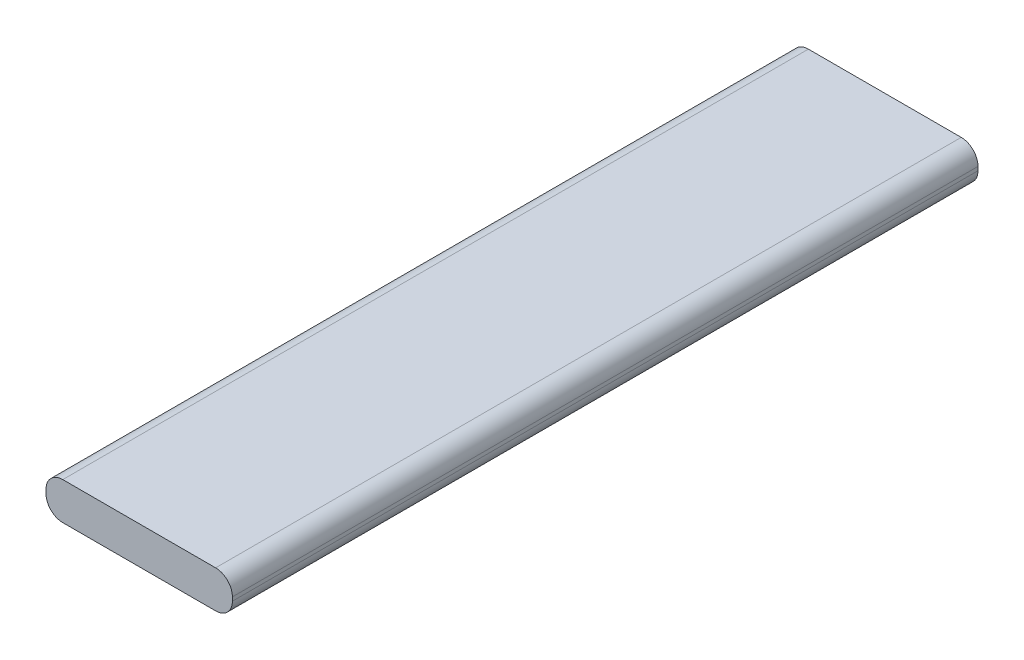
ISO-10303-21;
HEADER;
FILE_DESCRIPTION(('STEP AP214'),'2;1');
FILE_NAME('part.step','',(''),(''),'','','');
FILE_SCHEMA(('AUTOMOTIVE_DESIGN { 1 0 10303 214 1 1 1 1 }'));
ENDSEC;
DATA;
#1=APPLICATION_CONTEXT('core data for automotive mechanical design processes');
#2=APPLICATION_PROTOCOL_DEFINITION('international standard','automotive_design',2000,#1);
#3=PRODUCT_CONTEXT('',#1,'mechanical');
#4=PRODUCT('Part','Part','',(#3));
#5=PRODUCT_RELATED_PRODUCT_CATEGORY('part','',(#4));
#6=PRODUCT_DEFINITION_FORMATION('','',#4);
#7=PRODUCT_DEFINITION_CONTEXT('part definition',#1,'design');
#8=PRODUCT_DEFINITION('design','',#6,#7);
#9=PRODUCT_DEFINITION_SHAPE('','',#8);
#10=(LENGTH_UNIT() NAMED_UNIT(*) SI_UNIT(.MILLI.,.METRE.));
#11=(NAMED_UNIT(*) PLANE_ANGLE_UNIT() SI_UNIT($,.RADIAN.));
#12=(NAMED_UNIT(*) SI_UNIT($,.STERADIAN.) SOLID_ANGLE_UNIT());
#13=UNCERTAINTY_MEASURE_WITH_UNIT(LENGTH_MEASURE(1.E-05),#10,'distance_accuracy_value','');
#14=(GEOMETRIC_REPRESENTATION_CONTEXT(3) GLOBAL_UNCERTAINTY_ASSIGNED_CONTEXT((#13)) GLOBAL_UNIT_ASSIGNED_CONTEXT((#10,
#11,#12)) REPRESENTATION_CONTEXT('',''));
#15=CARTESIAN_POINT('',(0.,0.,0.));
#16=DIRECTION('',(0.,0.,1.));
#17=DIRECTION('',(1.,0.,0.));
#18=AXIS2_PLACEMENT_3D('',#15,#16,#17);
#19=CARTESIAN_POINT('',(2.05,0.0500000000000005,20.));
#20=DIRECTION('',(0.,0.,-1.));
#21=DIRECTION('',(-1.,0.,0.));
#22=AXIS2_PLACEMENT_3D('',#19,#20,#21);
#23=CYLINDRICAL_SURFACE('',#22,0.45);
#24=CARTESIAN_POINT('',(2.05,0.0500000000000005,0.));
#25=DIRECTION('',(0.,0.,1.));
#26=DIRECTION('',(-1.,0.,0.));
#27=AXIS2_PLACEMENT_3D('',#24,#25,#26);
#28=CIRCLE('',#27,0.45);
#29=CARTESIAN_POINT('',(2.5,0.0499999999999973,0.));
#30=VERTEX_POINT('',#29);
#31=CARTESIAN_POINT('',(2.04999999999999,0.5,0.));
#32=VERTEX_POINT('',#31);
#33=EDGE_CURVE('E127',#30,#32,#28,.T.);
#34=ORIENTED_EDGE('',*,*,#33,.T.);
#35=DIRECTION('',(0.,0.,-1.));
#36=VECTOR('',#35,1.);
#37=CARTESIAN_POINT('',(2.04999999999999,0.5,20.));
#38=LINE('',#37,#36);
#39=CARTESIAN_POINT('',(2.04999999999999,0.5,20.));
#40=VERTEX_POINT('',#39);
#41=EDGE_CURVE('E11',#40,#32,#38,.T.);
#42=ORIENTED_EDGE('',*,*,#41,.F.);
#43=CARTESIAN_POINT('',(2.05,0.0500000000000005,20.));
#44=DIRECTION('',(0.,0.,1.));
#45=DIRECTION('',(-1.,0.,0.));
#46=AXIS2_PLACEMENT_3D('',#43,#44,#45);
#47=CIRCLE('',#46,0.45);
#48=CARTESIAN_POINT('',(2.5,0.0499999999999973,20.));
#49=VERTEX_POINT('',#48);
#50=EDGE_CURVE('E141',#49,#40,#47,.T.);
#51=ORIENTED_EDGE('',*,*,#50,.F.);
#52=DIRECTION('',(0.,0.,-1.));
#53=VECTOR('',#52,1.);
#54=CARTESIAN_POINT('',(2.5,0.0499999999999973,20.));
#55=LINE('',#54,#53);
#56=EDGE_CURVE('E123',#49,#30,#55,.T.);
#57=ORIENTED_EDGE('',*,*,#56,.T.);
#58=EDGE_LOOP('',(#34,#42,#51,#57));
#59=FACE_BOUND('',#58,.T.);
#60=ADVANCED_FACE('F31',(#59),#23,.T.);
#61=CARTESIAN_POINT('',(-2.05,0.5,20.));
#62=DIRECTION('',(0.,-1.,0.));
#63=DIRECTION('',(0.,0.,-1.));
#64=AXIS2_PLACEMENT_3D('',#61,#62,#63);
#65=PLANE('',#64);
#66=DIRECTION('',(-1.,0.,0.));
#67=VECTOR('',#66,1.);
#68=CARTESIAN_POINT('',(-2.05,0.5,0.));
#69=LINE('',#68,#67);
#70=CARTESIAN_POINT('',(-2.05,0.5,0.));
#71=VERTEX_POINT('',#70);
#72=EDGE_CURVE('E130',#32,#71,#69,.T.);
#73=ORIENTED_EDGE('',*,*,#72,.T.);
#74=DIRECTION('',(0.,0.,-1.));
#75=VECTOR('',#74,1.);
#76=CARTESIAN_POINT('',(-2.05,0.5,20.));
#77=LINE('',#76,#75);
#78=CARTESIAN_POINT('',(-2.05,0.5,20.));
#79=VERTEX_POINT('',#78);
#80=EDGE_CURVE('E39',#79,#71,#77,.T.);
#81=ORIENTED_EDGE('',*,*,#80,.F.);
#82=DIRECTION('',(-1.,0.,0.));
#83=VECTOR('',#82,1.);
#84=CARTESIAN_POINT('',(-2.05,0.5,20.));
#85=LINE('',#84,#83);
#86=EDGE_CURVE('E90',#40,#79,#85,.T.);
#87=ORIENTED_EDGE('',*,*,#86,.F.);
#88=ORIENTED_EDGE('',*,*,#41,.T.);
#89=EDGE_LOOP('',(#73,#81,#87,#88));
#90=FACE_BOUND('',#89,.T.);
#91=ADVANCED_FACE('F176',(#90),#65,.F.);
#92=CARTESIAN_POINT('',(-2.05,0.0500000000000005,20.));
#93=DIRECTION('',(0.,0.,-1.));
#94=DIRECTION('',(-1.,0.,0.));
#95=AXIS2_PLACEMENT_3D('',#92,#93,#94);
#96=CYLINDRICAL_SURFACE('',#95,0.45);
#97=CARTESIAN_POINT('',(-2.05,0.0500000000000005,0.));
#98=DIRECTION('',(0.,0.,1.));
#99=DIRECTION('',(1.,0.,0.));
#100=AXIS2_PLACEMENT_3D('',#97,#98,#99);
#101=CIRCLE('',#100,0.45);
#102=CARTESIAN_POINT('',(-2.5,0.0499999999999974,0.));
#103=VERTEX_POINT('',#102);
#104=EDGE_CURVE('E132',#71,#103,#101,.T.);
#105=ORIENTED_EDGE('',*,*,#104,.T.);
#106=DIRECTION('',(0.,0.,-1.));
#107=VECTOR('',#106,1.);
#108=CARTESIAN_POINT('',(-2.5,0.0499999999999974,20.));
#109=LINE('',#108,#107);
#110=CARTESIAN_POINT('',(-2.5,0.0499999999999974,20.));
#111=VERTEX_POINT('',#110);
#112=EDGE_CURVE('E148',#111,#103,#109,.T.);
#113=ORIENTED_EDGE('',*,*,#112,.F.);
#114=CARTESIAN_POINT('',(-2.05,0.0500000000000005,20.));
#115=DIRECTION('',(0.,0.,1.));
#116=DIRECTION('',(1.,0.,0.));
#117=AXIS2_PLACEMENT_3D('',#114,#115,#116);
#118=CIRCLE('',#117,0.45);
#119=EDGE_CURVE('E156',#79,#111,#118,.T.);
#120=ORIENTED_EDGE('',*,*,#119,.F.);
#121=ORIENTED_EDGE('',*,*,#80,.T.);
#122=EDGE_LOOP('',(#105,#113,#120,#121));
#123=FACE_BOUND('',#122,.T.);
#124=ADVANCED_FACE('F154',(#123),#96,.T.);
#125=CARTESIAN_POINT('',(-2.5,0.0499999999999973,20.));
#126=DIRECTION('',(1.,0.,0.));
#127=DIRECTION('',(0.,0.,-1.));
#128=AXIS2_PLACEMENT_3D('',#125,#126,#127);
#129=PLANE('',#128);
#130=DIRECTION('',(0.,-1.,0.));
#131=VECTOR('',#130,1.);
#132=CARTESIAN_POINT('',(-2.5,0.0499999999999973,0.));
#133=LINE('',#132,#131);
#134=CARTESIAN_POINT('',(-2.5,-0.0499999999999973,0.));
#135=VERTEX_POINT('',#134);
#136=EDGE_CURVE('E134',#103,#135,#133,.T.);
#137=ORIENTED_EDGE('',*,*,#136,.T.);
#138=DIRECTION('',(0.,0.,-1.));
#139=VECTOR('',#138,1.);
#140=CARTESIAN_POINT('',(-2.5,-0.0499999999999973,20.));
#141=LINE('',#140,#139);
#142=CARTESIAN_POINT('',(-2.5,-0.0499999999999973,20.));
#143=VERTEX_POINT('',#142);
#144=EDGE_CURVE('E145',#143,#135,#141,.T.);
#145=ORIENTED_EDGE('',*,*,#144,.F.);
#146=DIRECTION('',(0.,-1.,0.));
#147=VECTOR('',#146,1.);
#148=CARTESIAN_POINT('',(-2.5,0.0499999999999973,20.));
#149=LINE('',#148,#147);
#150=EDGE_CURVE('E168',#111,#143,#149,.T.);
#151=ORIENTED_EDGE('',*,*,#150,.F.);
#152=ORIENTED_EDGE('',*,*,#112,.T.);
#153=EDGE_LOOP('',(#137,#145,#151,#152));
#154=FACE_BOUND('',#153,.T.);
#155=ADVANCED_FACE('F164',(#154),#129,.F.);
#156=CARTESIAN_POINT('',(-2.05,-0.0500000000000005,20.));
#157=DIRECTION('',(0.,0.,-1.));
#158=DIRECTION('',(-1.,0.,0.));
#159=AXIS2_PLACEMENT_3D('',#156,#157,#158);
#160=CYLINDRICAL_SURFACE('',#159,0.45);
#161=CARTESIAN_POINT('',(-2.05,-0.0500000000000005,0.));
#162=DIRECTION('',(0.,0.,1.));
#163=DIRECTION('',(1.,0.,0.));
#164=AXIS2_PLACEMENT_3D('',#161,#162,#163);
#165=CIRCLE('',#164,0.45);
#166=CARTESIAN_POINT('',(-2.05,-0.5,0.));
#167=VERTEX_POINT('',#166);
#168=EDGE_CURVE('E136',#135,#167,#165,.T.);
#169=ORIENTED_EDGE('',*,*,#168,.T.);
#170=DIRECTION('',(0.,0.,-1.));
#171=VECTOR('',#170,1.);
#172=CARTESIAN_POINT('',(-2.05,-0.5,20.));
#173=LINE('',#172,#171);
#174=CARTESIAN_POINT('',(-2.05,-0.5,20.));
#175=VERTEX_POINT('',#174);
#176=EDGE_CURVE('E118',#175,#167,#173,.T.);
#177=ORIENTED_EDGE('',*,*,#176,.F.);
#178=CARTESIAN_POINT('',(-2.05,-0.0500000000000005,20.));
#179=DIRECTION('',(0.,0.,1.));
#180=DIRECTION('',(1.,0.,0.));
#181=AXIS2_PLACEMENT_3D('',#178,#179,#180);
#182=CIRCLE('',#181,0.45);
#183=EDGE_CURVE('E109',#143,#175,#182,.T.);
#184=ORIENTED_EDGE('',*,*,#183,.F.);
#185=ORIENTED_EDGE('',*,*,#144,.T.);
#186=EDGE_LOOP('',(#169,#177,#184,#185));
#187=FACE_BOUND('',#186,.T.);
#188=ADVANCED_FACE('F167',(#187),#160,.T.);
#189=CARTESIAN_POINT('',(-2.05,-0.5,20.));
#190=DIRECTION('',(0.,1.,0.));
#191=DIRECTION('',(0.,0.,1.));
#192=AXIS2_PLACEMENT_3D('',#189,#190,#191);
#193=PLANE('',#192);
#194=DIRECTION('',(1.,0.,0.));
#195=VECTOR('',#194,1.);
#196=CARTESIAN_POINT('',(-2.05,-0.5,0.));
#197=LINE('',#196,#195);
#198=CARTESIAN_POINT('',(2.04999999999999,-0.5,0.));
#199=VERTEX_POINT('',#198);
#200=EDGE_CURVE('E117',#167,#199,#197,.T.);
#201=ORIENTED_EDGE('',*,*,#200,.T.);
#202=DIRECTION('',(0.,0.,-1.));
#203=VECTOR('',#202,1.);
#204=CARTESIAN_POINT('',(2.04999999999999,-0.5,20.));
#205=LINE('',#204,#203);
#206=CARTESIAN_POINT('',(2.04999999999999,-0.5,20.));
#207=VERTEX_POINT('',#206);
#208=EDGE_CURVE('E114',#207,#199,#205,.T.);
#209=ORIENTED_EDGE('',*,*,#208,.F.);
#210=DIRECTION('',(1.,0.,0.));
#211=VECTOR('',#210,1.);
#212=CARTESIAN_POINT('',(-2.05,-0.5,20.));
#213=LINE('',#212,#211);
#214=EDGE_CURVE('E103',#175,#207,#213,.T.);
#215=ORIENTED_EDGE('',*,*,#214,.F.);
#216=ORIENTED_EDGE('',*,*,#176,.T.);
#217=EDGE_LOOP('',(#201,#209,#215,#216));
#218=FACE_BOUND('',#217,.T.);
#219=ADVANCED_FACE('F115',(#218),#193,.F.);
#220=CARTESIAN_POINT('',(2.05,-0.0500000000000005,20.));
#221=DIRECTION('',(0.,0.,-1.));
#222=DIRECTION('',(-1.,0.,0.));
#223=AXIS2_PLACEMENT_3D('',#220,#221,#222);
#224=CYLINDRICAL_SURFACE('',#223,0.45);
#225=CARTESIAN_POINT('',(2.05,-0.0500000000000005,0.));
#226=DIRECTION('',(0.,0.,1.));
#227=DIRECTION('',(1.,0.,0.));
#228=AXIS2_PLACEMENT_3D('',#225,#226,#227);
#229=CIRCLE('',#228,0.45);
#230=CARTESIAN_POINT('',(2.5,-0.0499999999999973,0.));
#231=VERTEX_POINT('',#230);
#232=EDGE_CURVE('E76',#199,#231,#229,.T.);
#233=ORIENTED_EDGE('',*,*,#232,.T.);
#234=DIRECTION('',(0.,0.,-1.));
#235=VECTOR('',#234,1.);
#236=CARTESIAN_POINT('',(2.5,-0.0499999999999973,20.));
#237=LINE('',#236,#235);
#238=CARTESIAN_POINT('',(2.5,-0.0499999999999973,20.));
#239=VERTEX_POINT('',#238);
#240=EDGE_CURVE('E119',#239,#231,#237,.T.);
#241=ORIENTED_EDGE('',*,*,#240,.F.);
#242=CARTESIAN_POINT('',(2.05,-0.0500000000000005,20.));
#243=DIRECTION('',(0.,0.,1.));
#244=DIRECTION('',(1.,0.,0.));
#245=AXIS2_PLACEMENT_3D('',#242,#243,#244);
#246=CIRCLE('',#245,0.45);
#247=EDGE_CURVE('E107',#207,#239,#246,.T.);
#248=ORIENTED_EDGE('',*,*,#247,.F.);
#249=ORIENTED_EDGE('',*,*,#208,.T.);
#250=EDGE_LOOP('',(#233,#241,#248,#249));
#251=FACE_BOUND('',#250,.T.);
#252=ADVANCED_FACE('F121',(#251),#224,.T.);
#253=CARTESIAN_POINT('',(2.5,0.0499999999999973,20.));
#254=DIRECTION('',(-1.,0.,0.));
#255=DIRECTION('',(0.,0.,1.));
#256=AXIS2_PLACEMENT_3D('',#253,#254,#255);
#257=PLANE('',#256);
#258=DIRECTION('',(0.,1.,0.));
#259=VECTOR('',#258,1.);
#260=CARTESIAN_POINT('',(2.5,0.0499999999999973,0.));
#261=LINE('',#260,#259);
#262=EDGE_CURVE('E82',#231,#30,#261,.T.);
#263=ORIENTED_EDGE('',*,*,#262,.T.);
#264=ORIENTED_EDGE('',*,*,#56,.F.);
#265=DIRECTION('',(0.,1.,0.));
#266=VECTOR('',#265,1.);
#267=CARTESIAN_POINT('',(2.5,0.0499999999999973,20.));
#268=LINE('',#267,#266);
#269=EDGE_CURVE('E47',#239,#49,#268,.T.);
#270=ORIENTED_EDGE('',*,*,#269,.F.);
#271=ORIENTED_EDGE('',*,*,#240,.T.);
#272=EDGE_LOOP('',(#263,#264,#270,#271));
#273=FACE_BOUND('',#272,.T.);
#274=ADVANCED_FACE('F192',(#273),#257,.F.);
#275=CARTESIAN_POINT('',(2.05,0.0500000000000005,20.));
#276=DIRECTION('',(0.,0.,-1.));
#277=DIRECTION('',(-1.,0.,0.));
#278=AXIS2_PLACEMENT_3D('',#275,#276,#277);
#279=PLANE('',#278);
#280=ORIENTED_EDGE('',*,*,#50,.T.);
#281=ORIENTED_EDGE('',*,*,#86,.T.);
#282=ORIENTED_EDGE('',*,*,#119,.T.);
#283=ORIENTED_EDGE('',*,*,#150,.T.);
#284=ORIENTED_EDGE('',*,*,#183,.T.);
#285=ORIENTED_EDGE('',*,*,#214,.T.);
#286=ORIENTED_EDGE('',*,*,#247,.T.);
#287=ORIENTED_EDGE('',*,*,#269,.T.);
#288=EDGE_LOOP('',(#280,#281,#282,#283,#284,#285,#286,#287));
#289=FACE_BOUND('',#288,.T.);
#290=ADVANCED_FACE('F105',(#289),#279,.F.);
#291=CARTESIAN_POINT('',(2.05,0.0500000000000005,0.));
#292=DIRECTION('',(0.,0.,-1.));
#293=DIRECTION('',(-1.,0.,0.));
#294=AXIS2_PLACEMENT_3D('',#291,#292,#293);
#295=PLANE('',#294);
#296=ORIENTED_EDGE('',*,*,#33,.F.);
#297=ORIENTED_EDGE('',*,*,#262,.F.);
#298=ORIENTED_EDGE('',*,*,#232,.F.);
#299=ORIENTED_EDGE('',*,*,#200,.F.);
#300=ORIENTED_EDGE('',*,*,#168,.F.);
#301=ORIENTED_EDGE('',*,*,#136,.F.);
#302=ORIENTED_EDGE('',*,*,#104,.F.);
#303=ORIENTED_EDGE('',*,*,#72,.F.);
#304=EDGE_LOOP('',(#296,#297,#298,#299,#300,#301,#302,#303));
#305=FACE_BOUND('',#304,.T.);
#306=ADVANCED_FACE('F160',(#305),#295,.T.);
#307=CLOSED_SHELL('',(#60,#91,#124,#155,#188,#219,#252,#274,#290,#306));
#308=MANIFOLD_SOLID_BREP('B2',#307);
#309=ADVANCED_BREP_SHAPE_REPRESENTATION('',(#18,#308),#14);
#310=SHAPE_DEFINITION_REPRESENTATION(#9,#309);
ENDSEC;
END-ISO-10303-21;
